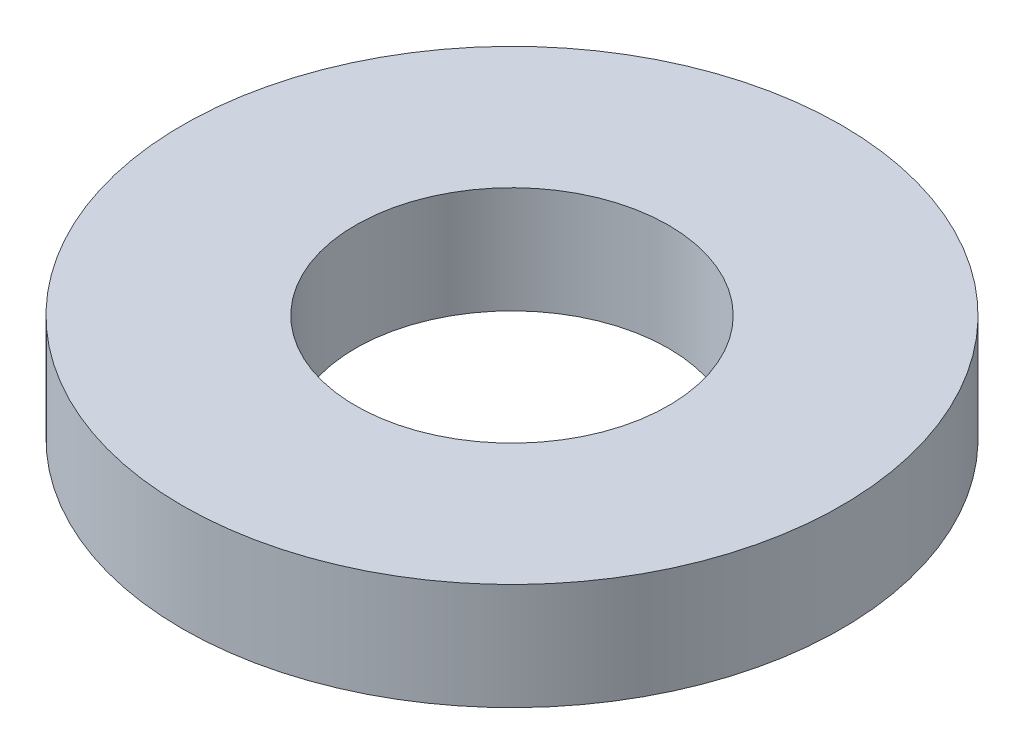
ISO-10303-21;
HEADER;
FILE_DESCRIPTION(('STEP AP214'),'2;1');
FILE_NAME('part.step','',(''),(''),'','','');
FILE_SCHEMA(('AUTOMOTIVE_DESIGN { 1 0 10303 214 1 1 1 1 }'));
ENDSEC;
DATA;
#1=APPLICATION_CONTEXT('core data for automotive mechanical design processes');
#2=APPLICATION_PROTOCOL_DEFINITION('international standard','automotive_design',2000,#1);
#3=PRODUCT_CONTEXT('',#1,'mechanical');
#4=PRODUCT('Part','Part','',(#3));
#5=PRODUCT_RELATED_PRODUCT_CATEGORY('part','',(#4));
#6=PRODUCT_DEFINITION_FORMATION('','',#4);
#7=PRODUCT_DEFINITION_CONTEXT('part definition',#1,'design');
#8=PRODUCT_DEFINITION('design','',#6,#7);
#9=PRODUCT_DEFINITION_SHAPE('','',#8);
#10=(LENGTH_UNIT() NAMED_UNIT(*) SI_UNIT(.MILLI.,.METRE.));
#11=(NAMED_UNIT(*) PLANE_ANGLE_UNIT() SI_UNIT($,.RADIAN.));
#12=(NAMED_UNIT(*) SI_UNIT($,.STERADIAN.) SOLID_ANGLE_UNIT());
#13=UNCERTAINTY_MEASURE_WITH_UNIT(LENGTH_MEASURE(1.E-05),#10,'distance_accuracy_value','');
#14=(GEOMETRIC_REPRESENTATION_CONTEXT(3) GLOBAL_UNCERTAINTY_ASSIGNED_CONTEXT((#13)) GLOBAL_UNIT_ASSIGNED_CONTEXT((#10,
#11,#12)) REPRESENTATION_CONTEXT('',''));
#15=CARTESIAN_POINT('',(0.,0.,0.));
#16=DIRECTION('',(0.,0.,1.));
#17=DIRECTION('',(1.,0.,0.));
#18=AXIS2_PLACEMENT_3D('',#15,#16,#17);
#19=CARTESIAN_POINT('',(0.,4.,0.));
#20=DIRECTION('',(0.,-1.,0.));
#21=DIRECTION('',(0.,0.,-1.));
#22=AXIS2_PLACEMENT_3D('',#19,#20,#21);
#23=CYLINDRICAL_SURFACE('',#22,12.36);
#24=CARTESIAN_POINT('',(0.,4.,0.));
#25=DIRECTION('',(0.,1.,0.));
#26=DIRECTION('',(0.,0.,1.));
#27=AXIS2_PLACEMENT_3D('',#24,#25,#26);
#28=CIRCLE('',#27,12.36);
#29=CARTESIAN_POINT('',(0.,4.,12.36));
#30=VERTEX_POINT('',#29);
#31=EDGE_CURVE('E10',#30,#30,#28,.T.);
#32=ORIENTED_EDGE('',*,*,#31,.F.);
#33=EDGE_LOOP('',(#32));
#34=FACE_BOUND('',#33,.T.);
#35=CARTESIAN_POINT('',(0.,0.,0.));
#36=DIRECTION('',(0.,1.,0.));
#37=DIRECTION('',(0.,0.,1.));
#38=AXIS2_PLACEMENT_3D('',#35,#36,#37);
#39=CIRCLE('',#38,12.36);
#40=CARTESIAN_POINT('',(0.,0.,12.36));
#41=VERTEX_POINT('',#40);
#42=EDGE_CURVE('E46',#41,#41,#39,.T.);
#43=ORIENTED_EDGE('',*,*,#42,.T.);
#44=EDGE_LOOP('',(#43));
#45=FACE_BOUND('',#44,.T.);
#46=ADVANCED_FACE('F43',(#34,#45),#23,.T.);
#47=CARTESIAN_POINT('',(0.,4.,0.));
#48=DIRECTION('',(0.,1.,0.));
#49=DIRECTION('',(0.,0.,1.));
#50=AXIS2_PLACEMENT_3D('',#47,#48,#49);
#51=PLANE('',#50);
#52=CARTESIAN_POINT('',(0.,4.,0.));
#53=DIRECTION('',(0.,-1.,0.));
#54=DIRECTION('',(0.,0.,-1.));
#55=AXIS2_PLACEMENT_3D('',#52,#53,#54);
#56=CIRCLE('',#55,5.8674);
#57=CARTESIAN_POINT('',(0.,4.,-5.8674));
#58=VERTEX_POINT('',#57);
#59=EDGE_CURVE('E55',#58,#58,#56,.T.);
#60=ORIENTED_EDGE('',*,*,#59,.T.);
#61=EDGE_LOOP('',(#60));
#62=FACE_BOUND('',#61,.T.);
#63=ORIENTED_EDGE('',*,*,#31,.T.);
#64=EDGE_LOOP('',(#63));
#65=FACE_BOUND('',#64,.T.);
#66=ADVANCED_FACE('F65',(#62,#65),#51,.T.);
#67=CARTESIAN_POINT('',(0.,0.,0.));
#68=DIRECTION('',(0.,1.,0.));
#69=DIRECTION('',(0.,0.,1.));
#70=AXIS2_PLACEMENT_3D('',#67,#68,#69);
#71=PLANE('',#70);
#72=CARTESIAN_POINT('',(0.,0.,0.));
#73=DIRECTION('',(0.,-1.,0.));
#74=DIRECTION('',(0.,0.,-1.));
#75=AXIS2_PLACEMENT_3D('',#72,#73,#74);
#76=CIRCLE('',#75,5.8674);
#77=CARTESIAN_POINT('',(0.,0.,-5.8674));
#78=VERTEX_POINT('',#77);
#79=EDGE_CURVE('E57',#78,#78,#76,.T.);
#80=ORIENTED_EDGE('',*,*,#79,.F.);
#81=EDGE_LOOP('',(#80));
#82=FACE_BOUND('',#81,.T.);
#83=ORIENTED_EDGE('',*,*,#42,.F.);
#84=EDGE_LOOP('',(#83));
#85=FACE_BOUND('',#84,.T.);
#86=ADVANCED_FACE('F70',(#82,#85),#71,.F.);
#87=CARTESIAN_POINT('',(0.,4.,0.));
#88=DIRECTION('',(0.,-1.,0.));
#89=DIRECTION('',(0.,0.,-1.));
#90=AXIS2_PLACEMENT_3D('',#87,#88,#89);
#91=CYLINDRICAL_SURFACE('',#90,5.8674);
#92=ORIENTED_EDGE('',*,*,#59,.F.);
#93=EDGE_LOOP('',(#92));
#94=FACE_BOUND('',#93,.T.);
#95=ORIENTED_EDGE('',*,*,#79,.T.);
#96=EDGE_LOOP('',(#95));
#97=FACE_BOUND('',#96,.T.);
#98=ADVANCED_FACE('F67',(#94,#97),#91,.F.);
#99=CLOSED_SHELL('',(#46,#66,#86,#98));
#100=MANIFOLD_SOLID_BREP('B2',#99);
#101=ADVANCED_BREP_SHAPE_REPRESENTATION('',(#18,#100),#14);
#102=SHAPE_DEFINITION_REPRESENTATION(#9,#101);
ENDSEC;
END-ISO-10303-21;
